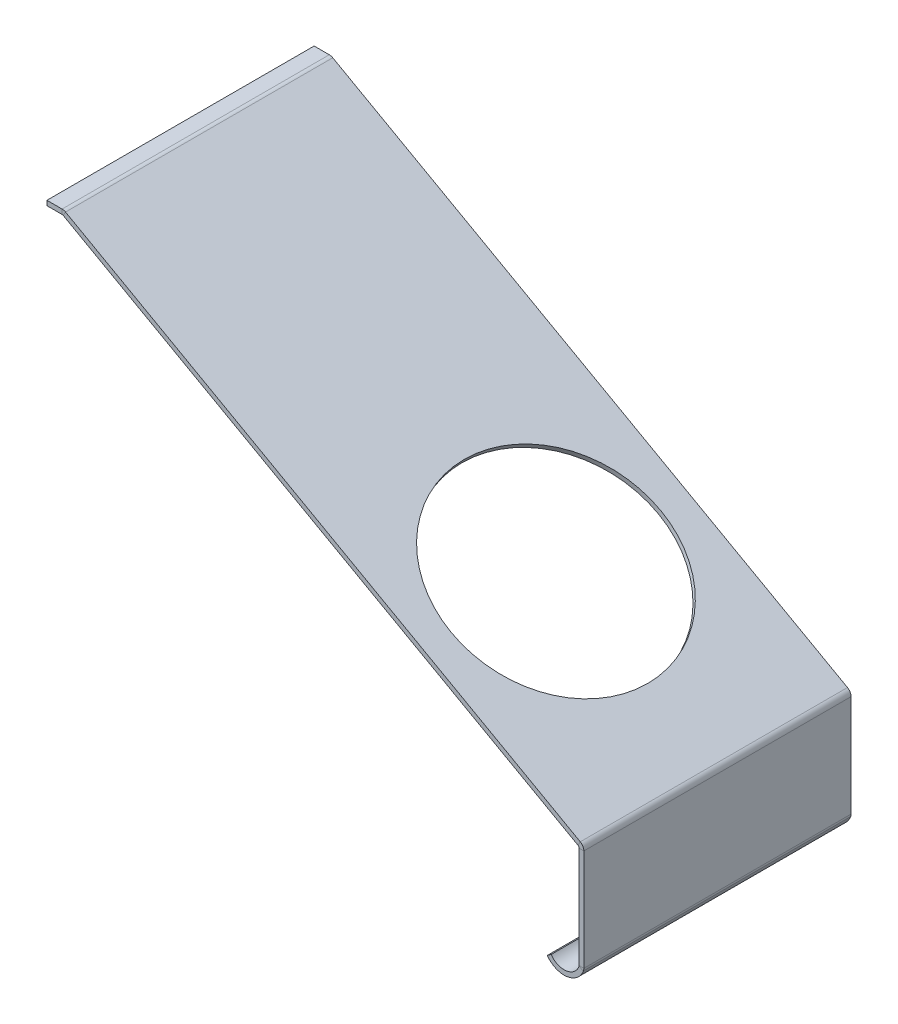
ISO-10303-21;
HEADER;
FILE_DESCRIPTION(('STEP AP214'),'2;1');
FILE_NAME('part.step','',(''),(''),'','','');
FILE_SCHEMA(('AUTOMOTIVE_DESIGN { 1 0 10303 214 1 1 1 1 }'));
ENDSEC;
DATA;
#1=APPLICATION_CONTEXT('core data for automotive mechanical design processes');
#2=APPLICATION_PROTOCOL_DEFINITION('international standard','automotive_design',2000,#1);
#3=PRODUCT_CONTEXT('',#1,'mechanical');
#4=PRODUCT('Part','Part','',(#3));
#5=PRODUCT_RELATED_PRODUCT_CATEGORY('part','',(#4));
#6=PRODUCT_DEFINITION_FORMATION('','',#4);
#7=PRODUCT_DEFINITION_CONTEXT('part definition',#1,'design');
#8=PRODUCT_DEFINITION('design','',#6,#7);
#9=PRODUCT_DEFINITION_SHAPE('','',#8);
#10=(LENGTH_UNIT() NAMED_UNIT(*) SI_UNIT(.MILLI.,.METRE.));
#11=(NAMED_UNIT(*) PLANE_ANGLE_UNIT() SI_UNIT($,.RADIAN.));
#12=(NAMED_UNIT(*) SI_UNIT($,.STERADIAN.) SOLID_ANGLE_UNIT());
#13=UNCERTAINTY_MEASURE_WITH_UNIT(LENGTH_MEASURE(1.E-05),#10,'distance_accuracy_value','');
#14=(GEOMETRIC_REPRESENTATION_CONTEXT(3) GLOBAL_UNCERTAINTY_ASSIGNED_CONTEXT((#13)) GLOBAL_UNIT_ASSIGNED_CONTEXT((#10,
#11,#12)) REPRESENTATION_CONTEXT('',''));
#15=CARTESIAN_POINT('',(0.,0.,0.));
#16=DIRECTION('',(0.,0.,1.));
#17=DIRECTION('',(1.,0.,0.));
#18=AXIS2_PLACEMENT_3D('',#15,#16,#17);
#19=CARTESIAN_POINT('',(6.13483473526349,-2.31902648571097,85.));
#20=DIRECTION('',(0.,0.,1.));
#21=DIRECTION('',(1.,0.,0.));
#22=AXIS2_PLACEMENT_3D('',#19,#20,#21);
#23=PLANE('',#22);
#24=DIRECTION('',(-0.935400382627309,0.353590333833779,0.));
#25=VECTOR('',#24,1.);
#26=CARTESIAN_POINT('',(6.13483473526349,-2.31902648571097,85.));
#27=LINE('',#26,#25);
#28=CARTESIAN_POINT('',(6.13483473526349,-2.31902648571097,85.));
#29=VERTEX_POINT('',#28);
#30=CARTESIAN_POINT('',(4.73173416132255,-1.78864098496029,85.));
#31=VERTEX_POINT('',#30);
#32=EDGE_CURVE('E11',#29,#31,#27,.T.);
#33=ORIENTED_EDGE('',*,*,#32,.F.);
#34=CARTESIAN_POINT('',(4.04271823947927,-1.52818634505836,85.));
#35=DIRECTION('',(0.,0.,-1.));
#36=DIRECTION('',(-1.,0.,0.));
#37=AXIS2_PLACEMENT_3D('',#34,#35,#36);
#38=CIRCLE('',#37,2.2366);
#39=CARTESIAN_POINT('',(6.27931823947925,-1.52818634505836,85.));
#40=VERTEX_POINT('',#39);
#41=EDGE_CURVE('E299',#40,#29,#38,.T.);
#42=ORIENTED_EDGE('',*,*,#41,.F.);
#43=DIRECTION('',(1.,0.,0.));
#44=VECTOR('',#43,1.);
#45=CARTESIAN_POINT('',(4.77931823947925,-1.52818634505836,85.));
#46=LINE('',#45,#44);
#47=CARTESIAN_POINT('',(4.77931823947925,-1.52818634505836,85.));
#48=VERTEX_POINT('',#47);
#49=EDGE_CURVE('E45',#48,#40,#46,.T.);
#50=ORIENTED_EDGE('',*,*,#49,.F.);
#51=CARTESIAN_POINT('',(4.04271823947927,-1.52818634505836,85.));
#52=DIRECTION('',(0.,0.,1.));
#53=DIRECTION('',(1.,0.,0.));
#54=AXIS2_PLACEMENT_3D('',#51,#52,#53);
#55=CIRCLE('',#54,0.7366);
#56=EDGE_CURVE('E193',#48,#31,#55,.F.);
#57=ORIENTED_EDGE('',*,*,#56,.T.);
#58=EDGE_LOOP('',(#33,#42,#50,#57));
#59=FACE_BOUND('',#58,.T.);
#60=ADVANCED_FACE('F36',(#59),#23,.T.);
#61=CARTESIAN_POINT('',(4.77931823947925,-1.52818634505836,85.));
#62=DIRECTION('',(0.,0.,1.));
#63=DIRECTION('',(1.,0.,0.));
#64=AXIS2_PLACEMENT_3D('',#61,#62,#63);
#65=PLANE('',#64);
#66=CARTESIAN_POINT('',(0.,0.,85.));
#67=DIRECTION('',(0.,0.,-1.));
#68=DIRECTION('',(-1.,0.,0.));
#69=AXIS2_PLACEMENT_3D('',#66,#67,#68);
#70=CIRCLE('',#69,6.55851210797269);
#71=CARTESIAN_POINT('',(-5.3580191885475,-3.78228918058643,85.));
#72=VERTEX_POINT('',#71);
#73=EDGE_CURVE('E303',#29,#72,#70,.T.);
#74=ORIENTED_EDGE('',*,*,#73,.F.);
#75=ORIENTED_EDGE('',*,*,#32,.T.);
#76=CARTESIAN_POINT('',(0.,0.,85.));
#77=DIRECTION('',(0.,0.,1.));
#78=DIRECTION('',(1.,0.,0.));
#79=AXIS2_PLACEMENT_3D('',#76,#77,#78);
#80=CIRCLE('',#79,5.05851210797269);
#81=CARTESIAN_POINT('',(-4.13258441759523,-2.91724026743689,85.));
#82=VERTEX_POINT('',#81);
#83=EDGE_CURVE('E117',#31,#82,#80,.F.);
#84=ORIENTED_EDGE('',*,*,#83,.T.);
#85=DIRECTION('',(0.816956513968188,0.576699275432999,0.));
#86=VECTOR('',#85,1.);
#87=CARTESIAN_POINT('',(-5.3580191885475,-3.78228918058643,85.));
#88=LINE('',#87,#86);
#89=EDGE_CURVE('E608',#72,#82,#88,.T.);
#90=ORIENTED_EDGE('',*,*,#89,.F.);
#91=EDGE_LOOP('',(#74,#75,#84,#90));
#92=FACE_BOUND('',#91,.T.);
#93=ADVANCED_FACE('F392',(#92),#65,.T.);
#94=CARTESIAN_POINT('',(6.27931823947925,-1.5281863450583,0.));
#95=DIRECTION('',(0.,0.,-1.));
#96=DIRECTION('',(-1.,0.,0.));
#97=AXIS2_PLACEMENT_3D('',#94,#95,#96);
#98=PLANE('',#97);
#99=DIRECTION('',(-1.,0.,0.));
#100=VECTOR('',#99,1.);
#101=CARTESIAN_POINT('',(6.27931823947925,-1.5281863450583,0.));
#102=LINE('',#101,#100);
#103=CARTESIAN_POINT('',(6.27931823947925,-1.5281863450583,0.));
#104=VERTEX_POINT('',#103);
#105=CARTESIAN_POINT('',(4.77931823947925,-1.5281863450583,0.));
#106=VERTEX_POINT('',#105);
#107=EDGE_CURVE('E104',#104,#106,#102,.T.);
#108=ORIENTED_EDGE('',*,*,#107,.F.);
#109=CARTESIAN_POINT('',(4.04271823947927,-1.5281863450583,0.));
#110=DIRECTION('',(0.,0.,-1.));
#111=DIRECTION('',(-1.,0.,0.));
#112=AXIS2_PLACEMENT_3D('',#109,#110,#111);
#113=CIRCLE('',#112,2.2366);
#114=CARTESIAN_POINT('',(6.13483473526349,-2.31902648571097,0.));
#115=VERTEX_POINT('',#114);
#116=EDGE_CURVE('E208',#104,#115,#113,.T.);
#117=ORIENTED_EDGE('',*,*,#116,.T.);
#118=DIRECTION('',(0.935400382627309,-0.353590333833779,0.));
#119=VECTOR('',#118,1.);
#120=CARTESIAN_POINT('',(4.7317341613225,-1.78864098496029,0.));
#121=LINE('',#120,#119);
#122=CARTESIAN_POINT('',(4.7317341613225,-1.78864098496029,0.));
#123=VERTEX_POINT('',#122);
#124=EDGE_CURVE('E111',#123,#115,#121,.T.);
#125=ORIENTED_EDGE('',*,*,#124,.F.);
#126=CARTESIAN_POINT('',(4.04271823947927,-1.5281863450583,0.));
#127=DIRECTION('',(0.,0.,1.));
#128=DIRECTION('',(1.,0.,0.));
#129=AXIS2_PLACEMENT_3D('',#126,#127,#128);
#130=CIRCLE('',#129,0.7366);
#131=EDGE_CURVE('E239',#106,#123,#130,.F.);
#132=ORIENTED_EDGE('',*,*,#131,.F.);
#133=EDGE_LOOP('',(#108,#117,#125,#132));
#134=FACE_BOUND('',#133,.T.);
#135=ADVANCED_FACE('F396',(#134),#98,.T.);
#136=CARTESIAN_POINT('',(4.7317341613225,-1.78864098496029,0.));
#137=DIRECTION('',(0.,0.,-1.));
#138=DIRECTION('',(-1.,0.,0.));
#139=AXIS2_PLACEMENT_3D('',#136,#137,#138);
#140=PLANE('',#139);
#141=DIRECTION('',(0.,-1.,0.));
#142=VECTOR('',#141,1.);
#143=CARTESIAN_POINT('',(6.27931823947925,32.1194241644101,0.));
#144=LINE('',#143,#142);
#145=CARTESIAN_POINT('',(6.27931823947925,30.8079333348794,0.));
#146=VERTEX_POINT('',#145);
#147=EDGE_CURVE('E210',#146,#104,#144,.T.);
#148=ORIENTED_EDGE('',*,*,#147,.T.);
#149=ORIENTED_EDGE('',*,*,#107,.T.);
#150=DIRECTION('',(0.,1.,0.));
#151=VECTOR('',#150,1.);
#152=CARTESIAN_POINT('',(4.77931823947925,32.1194241644101,0.));
#153=LINE('',#152,#151);
#154=CARTESIAN_POINT('',(4.77931823947925,30.8079333348794,0.));
#155=VERTEX_POINT('',#154);
#156=EDGE_CURVE('E237',#155,#106,#153,.F.);
#157=ORIENTED_EDGE('',*,*,#156,.F.);
#158=DIRECTION('',(1.,0.,0.));
#159=VECTOR('',#158,1.);
#160=CARTESIAN_POINT('',(4.77931823947925,30.8079333348794,0.));
#161=LINE('',#160,#159);
#162=EDGE_CURVE('E285',#155,#146,#161,.T.);
#163=ORIENTED_EDGE('',*,*,#162,.T.);
#164=EDGE_LOOP('',(#148,#149,#157,#163));
#165=FACE_BOUND('',#164,.T.);
#166=ADVANCED_FACE('F340',(#165),#140,.T.);
#167=CARTESIAN_POINT('',(6.27931823947925,30.8079333348794,85.));
#168=DIRECTION('',(0.,0.,1.));
#169=DIRECTION('',(1.,0.,0.));
#170=AXIS2_PLACEMENT_3D('',#167,#168,#169);
#171=PLANE('',#170);
#172=DIRECTION('',(-1.,0.,0.));
#173=VECTOR('',#172,1.);
#174=CARTESIAN_POINT('',(6.27931823947925,30.8079333348794,85.));
#175=LINE('',#174,#173);
#176=CARTESIAN_POINT('',(6.27931823947925,30.8079333348794,85.));
#177=VERTEX_POINT('',#176);
#178=CARTESIAN_POINT('',(4.77931823947925,30.8079333348794,85.));
#179=VERTEX_POINT('',#178);
#180=EDGE_CURVE('E157',#177,#179,#175,.T.);
#181=ORIENTED_EDGE('',*,*,#180,.F.);
#182=CARTESIAN_POINT('',(4.04271823947927,30.8079333348794,85.));
#183=DIRECTION('',(0.,0.,-1.));
#184=DIRECTION('',(-1.,0.,0.));
#185=AXIS2_PLACEMENT_3D('',#182,#183,#184);
#186=CIRCLE('',#185,2.2366);
#187=CARTESIAN_POINT('',(5.1347932668917,32.7597918580573,85.));
#188=VERTEX_POINT('',#187);
#189=EDGE_CURVE('E306',#188,#177,#186,.T.);
#190=ORIENTED_EDGE('',*,*,#189,.F.);
#191=DIRECTION('',(0.488274625508566,0.872690030929923,0.));
#192=VECTOR('',#191,1.);
#193=CARTESIAN_POINT('',(4.40238132862886,31.4507568116624,85.));
#194=LINE('',#193,#192);
#195=CARTESIAN_POINT('',(4.40238132862886,31.4507568116624,85.));
#196=VERTEX_POINT('',#195);
#197=EDGE_CURVE('E169',#196,#188,#194,.T.);
#198=ORIENTED_EDGE('',*,*,#197,.F.);
#199=CARTESIAN_POINT('',(4.04271823947927,30.8079333348794,85.));
#200=DIRECTION('',(0.,0.,1.));
#201=DIRECTION('',(1.,0.,0.));
#202=AXIS2_PLACEMENT_3D('',#199,#200,#201);
#203=CIRCLE('',#202,0.7366);
#204=EDGE_CURVE('E172',#196,#179,#203,.F.);
#205=ORIENTED_EDGE('',*,*,#204,.T.);
#206=EDGE_LOOP('',(#181,#190,#198,#205));
#207=FACE_BOUND('',#206,.T.);
#208=ADVANCED_FACE('F174',(#207),#171,.T.);
#209=CARTESIAN_POINT('',(4.40238132862886,31.4507568116624,85.));
#210=DIRECTION('',(0.,0.,1.));
#211=DIRECTION('',(1.,0.,0.));
#212=AXIS2_PLACEMENT_3D('',#209,#210,#211);
#213=PLANE('',#212);
#214=DIRECTION('',(0.,-1.,0.));
#215=VECTOR('',#214,1.);
#216=CARTESIAN_POINT('',(6.27931823947925,32.1194241644101,85.));
#217=LINE('',#216,#215);
#218=EDGE_CURVE('E164',#177,#40,#217,.T.);
#219=ORIENTED_EDGE('',*,*,#218,.F.);
#220=ORIENTED_EDGE('',*,*,#180,.T.);
#221=DIRECTION('',(0.,1.,0.));
#222=VECTOR('',#221,1.);
#223=CARTESIAN_POINT('',(4.77931823947925,32.1194241644101,85.));
#224=LINE('',#223,#222);
#225=EDGE_CURVE('E161',#179,#48,#224,.F.);
#226=ORIENTED_EDGE('',*,*,#225,.T.);
#227=ORIENTED_EDGE('',*,*,#49,.T.);
#228=EDGE_LOOP('',(#219,#220,#226,#227));
#229=FACE_BOUND('',#228,.T.);
#230=ADVANCED_FACE('F159',(#229),#213,.T.);
#231=CARTESIAN_POINT('',(5.1347932668917,32.7597918580573,0.));
#232=DIRECTION('',(0.,0.,-1.));
#233=DIRECTION('',(-1.,0.,0.));
#234=AXIS2_PLACEMENT_3D('',#231,#232,#233);
#235=PLANE('',#234);
#236=DIRECTION('',(-0.488274625508566,-0.872690030929923,0.));
#237=VECTOR('',#236,1.);
#238=CARTESIAN_POINT('',(5.1347932668917,32.7597918580573,0.));
#239=LINE('',#238,#237);
#240=CARTESIAN_POINT('',(5.1347932668917,32.7597918580573,0.));
#241=VERTEX_POINT('',#240);
#242=CARTESIAN_POINT('',(4.40238132862886,31.4507568116624,0.));
#243=VERTEX_POINT('',#242);
#244=EDGE_CURVE('E287',#241,#243,#239,.T.);
#245=ORIENTED_EDGE('',*,*,#244,.F.);
#246=CARTESIAN_POINT('',(4.04271823947921,30.8079333348794,0.));
#247=DIRECTION('',(0.,0.,-1.));
#248=DIRECTION('',(-1.,0.,0.));
#249=AXIS2_PLACEMENT_3D('',#246,#247,#248);
#250=CIRCLE('',#249,2.2366);
#251=EDGE_CURVE('E212',#241,#146,#250,.T.);
#252=ORIENTED_EDGE('',*,*,#251,.T.);
#253=ORIENTED_EDGE('',*,*,#162,.F.);
#254=CARTESIAN_POINT('',(4.04271823947921,30.8079333348794,0.));
#255=DIRECTION('',(0.,0.,1.));
#256=DIRECTION('',(1.,0.,0.));
#257=AXIS2_PLACEMENT_3D('',#254,#255,#256);
#258=CIRCLE('',#257,0.7366);
#259=EDGE_CURVE('E185',#243,#155,#258,.F.);
#260=ORIENTED_EDGE('',*,*,#259,.F.);
#261=EDGE_LOOP('',(#245,#252,#253,#260));
#262=FACE_BOUND('',#261,.T.);
#263=ADVANCED_FACE('F338',(#262),#235,.T.);
#264=CARTESIAN_POINT('',(4.77931823947925,30.8079333348794,0.));
#265=DIRECTION('',(0.,0.,-1.));
#266=DIRECTION('',(-1.,0.,0.));
#267=AXIS2_PLACEMENT_3D('',#264,#265,#266);
#268=PLANE('',#267);
#269=DIRECTION('',(0.872690030929894,-0.488274625508617,0.));
#270=VECTOR('',#269,1.);
#271=CARTESIAN_POINT('',(-159.108326998089,124.654674574086,0.));
#272=LINE('',#271,#270);
#273=CARTESIAN_POINT('',(-158.599410426894,124.369933097264,0.));
#274=VERTEX_POINT('',#273);
#275=EDGE_CURVE('E215',#274,#241,#272,.T.);
#276=ORIENTED_EDGE('',*,*,#275,.T.);
#277=ORIENTED_EDGE('',*,*,#244,.T.);
#278=DIRECTION('',(0.872690030929894,-0.488274625508617,0.));
#279=VECTOR('',#278,1.);
#280=CARTESIAN_POINT('',(-159.840738936351,123.345639527691,0.));
#281=LINE('',#280,#279);
#282=CARTESIAN_POINT('',(-159.331822365157,123.060898050869,0.));
#283=VERTEX_POINT('',#282);
#284=EDGE_CURVE('E233',#283,#243,#281,.T.);
#285=ORIENTED_EDGE('',*,*,#284,.F.);
#286=DIRECTION('',(0.488274625508617,0.872690030929894,0.));
#287=VECTOR('',#286,1.);
#288=CARTESIAN_POINT('',(-159.331822365157,123.060898050869,0.));
#289=LINE('',#288,#287);
#290=EDGE_CURVE('E277',#283,#274,#289,.T.);
#291=ORIENTED_EDGE('',*,*,#290,.T.);
#292=EDGE_LOOP('',(#276,#277,#285,#291));
#293=FACE_BOUND('',#292,.T.);
#294=ADVANCED_FACE('F375',(#293),#268,.T.);
#295=CARTESIAN_POINT('',(-158.599410426894,124.369933097264,85.));
#296=DIRECTION('',(0.,0.,1.));
#297=DIRECTION('',(1.,0.,0.));
#298=AXIS2_PLACEMENT_3D('',#295,#296,#297);
#299=PLANE('',#298);
#300=DIRECTION('',(-0.488274625508617,-0.872690030929894,0.));
#301=VECTOR('',#300,1.);
#302=CARTESIAN_POINT('',(-158.599410426894,124.369933097264,85.));
#303=LINE('',#302,#301);
#304=CARTESIAN_POINT('',(-158.599410426894,124.369933097264,85.));
#305=VERTEX_POINT('',#304);
#306=CARTESIAN_POINT('',(-159.331822365157,123.060898050869,85.));
#307=VERTEX_POINT('',#306);
#308=EDGE_CURVE('E283',#305,#307,#303,.T.);
#309=ORIENTED_EDGE('',*,*,#308,.F.);
#310=CARTESIAN_POINT('',(-159.691485454307,122.418074574086,85.));
#311=DIRECTION('',(0.,0.,-1.));
#312=DIRECTION('',(-1.,0.,0.));
#313=AXIS2_PLACEMENT_3D('',#310,#311,#312);
#314=CIRCLE('',#313,2.2366);
#315=CARTESIAN_POINT('',(-159.691485454307,124.654674574086,85.));
#316=VERTEX_POINT('',#315);
#317=EDGE_CURVE('E314',#316,#305,#314,.T.);
#318=ORIENTED_EDGE('',*,*,#317,.F.);
#319=DIRECTION('',(0.,1.,0.));
#320=VECTOR('',#319,1.);
#321=CARTESIAN_POINT('',(-159.691485454307,123.154674574086,85.));
#322=LINE('',#321,#320);
#323=CARTESIAN_POINT('',(-159.691485454307,123.154674574086,85.));
#324=VERTEX_POINT('',#323);
#325=EDGE_CURVE('E281',#324,#316,#322,.T.);
#326=ORIENTED_EDGE('',*,*,#325,.F.);
#327=CARTESIAN_POINT('',(-159.691485454307,122.418074574086,85.));
#328=DIRECTION('',(0.,0.,1.));
#329=DIRECTION('',(1.,0.,0.));
#330=AXIS2_PLACEMENT_3D('',#327,#328,#329);
#331=CIRCLE('',#330,0.7366);
#332=EDGE_CURVE('E326',#324,#307,#331,.F.);
#333=ORIENTED_EDGE('',*,*,#332,.T.);
#334=EDGE_LOOP('',(#309,#318,#326,#333));
#335=FACE_BOUND('',#334,.T.);
#336=ADVANCED_FACE('F353',(#335),#299,.T.);
#337=CARTESIAN_POINT('',(-159.691485454307,123.154674574086,85.));
#338=DIRECTION('',(0.,0.,1.));
#339=DIRECTION('',(1.,0.,0.));
#340=AXIS2_PLACEMENT_3D('',#337,#338,#339);
#341=PLANE('',#340);
#342=DIRECTION('',(0.872690030929894,-0.488274625508617,0.));
#343=VECTOR('',#342,1.);
#344=CARTESIAN_POINT('',(-159.108326998088,124.654674574086,85.));
#345=LINE('',#344,#343);
#346=EDGE_CURVE('E308',#305,#188,#345,.T.);
#347=ORIENTED_EDGE('',*,*,#346,.F.);
#348=ORIENTED_EDGE('',*,*,#308,.T.);
#349=DIRECTION('',(0.872690030929894,-0.488274625508617,0.));
#350=VECTOR('',#349,1.);
#351=CARTESIAN_POINT('',(-159.840738936351,123.345639527691,85.));
#352=LINE('',#351,#350);
#353=EDGE_CURVE('E178',#307,#196,#352,.T.);
#354=ORIENTED_EDGE('',*,*,#353,.T.);
#355=ORIENTED_EDGE('',*,*,#197,.T.);
#356=EDGE_LOOP('',(#347,#348,#354,#355));
#357=FACE_BOUND('',#356,.T.);
#358=ADVANCED_FACE('F332',(#357),#341,.T.);
#359=CARTESIAN_POINT('',(-159.691485454307,124.654674574086,0.));
#360=DIRECTION('',(0.,0.,-1.));
#361=DIRECTION('',(-1.,0.,0.));
#362=AXIS2_PLACEMENT_3D('',#359,#360,#361);
#363=PLANE('',#362);
#364=DIRECTION('',(0.,-1.,0.));
#365=VECTOR('',#364,1.);
#366=CARTESIAN_POINT('',(-159.691485454307,124.654674574086,0.));
#367=LINE('',#366,#365);
#368=CARTESIAN_POINT('',(-159.691485454307,124.654674574086,0.));
#369=VERTEX_POINT('',#368);
#370=CARTESIAN_POINT('',(-159.691485454307,123.154674574086,0.));
#371=VERTEX_POINT('',#370);
#372=EDGE_CURVE('E279',#369,#371,#367,.T.);
#373=ORIENTED_EDGE('',*,*,#372,.F.);
#374=CARTESIAN_POINT('',(-159.691485454307,122.418074574086,0.));
#375=DIRECTION('',(0.,0.,-1.));
#376=DIRECTION('',(-1.,0.,0.));
#377=AXIS2_PLACEMENT_3D('',#374,#375,#376);
#378=CIRCLE('',#377,2.2366);
#379=EDGE_CURVE('E218',#369,#274,#378,.T.);
#380=ORIENTED_EDGE('',*,*,#379,.T.);
#381=ORIENTED_EDGE('',*,*,#290,.F.);
#382=CARTESIAN_POINT('',(-159.691485454307,122.418074574086,0.));
#383=DIRECTION('',(0.,0.,1.));
#384=DIRECTION('',(1.,0.,0.));
#385=AXIS2_PLACEMENT_3D('',#382,#383,#384);
#386=CIRCLE('',#385,0.7366);
#387=EDGE_CURVE('E230',#371,#283,#386,.F.);
#388=ORIENTED_EDGE('',*,*,#387,.F.);
#389=EDGE_LOOP('',(#373,#380,#381,#388));
#390=FACE_BOUND('',#389,.T.);
#391=ADVANCED_FACE('F377',(#390),#363,.T.);
#392=CARTESIAN_POINT('',(-159.331822365157,123.060898050869,0.));
#393=DIRECTION('',(0.,0.,-1.));
#394=DIRECTION('',(-1.,0.,0.));
#395=AXIS2_PLACEMENT_3D('',#392,#393,#394);
#396=PLANE('',#395);
#397=DIRECTION('',(1.,0.,0.));
#398=VECTOR('',#397,1.);
#399=CARTESIAN_POINT('',(-159.108326998089,124.654674574086,0.));
#400=LINE('',#399,#398);
#401=CARTESIAN_POINT('',(-164.5169492657,124.654674574086,0.));
#402=VERTEX_POINT('',#401);
#403=EDGE_CURVE('E221',#402,#369,#400,.T.);
#404=ORIENTED_EDGE('',*,*,#403,.T.);
#405=ORIENTED_EDGE('',*,*,#372,.T.);
#406=DIRECTION('',(1.,0.,0.));
#407=VECTOR('',#406,1.);
#408=CARTESIAN_POINT('',(-159.108326998089,123.154674574086,0.));
#409=LINE('',#408,#407);
#410=CARTESIAN_POINT('',(-164.5169492657,123.154674574086,0.));
#411=VERTEX_POINT('',#410);
#412=EDGE_CURVE('E227',#411,#371,#409,.T.);
#413=ORIENTED_EDGE('',*,*,#412,.F.);
#414=DIRECTION('',(0.,1.,0.));
#415=VECTOR('',#414,1.);
#416=CARTESIAN_POINT('',(-164.5169492657,123.154674574086,0.));
#417=LINE('',#416,#415);
#418=EDGE_CURVE('E224',#411,#402,#417,.T.);
#419=ORIENTED_EDGE('',*,*,#418,.T.);
#420=EDGE_LOOP('',(#404,#405,#413,#419));
#421=FACE_BOUND('',#420,.T.);
#422=ADVANCED_FACE('F379',(#421),#396,.T.);
#423=CARTESIAN_POINT('',(0.,0.,85.));
#424=DIRECTION('',(0.,0.,-1.));
#425=DIRECTION('',(-1.,0.,0.));
#426=AXIS2_PLACEMENT_3D('',#423,#424,#425);
#427=CYLINDRICAL_SURFACE('',#426,5.05851210797269);
#428=CARTESIAN_POINT('',(0.,0.,0.));
#429=DIRECTION('',(0.,0.,1.));
#430=DIRECTION('',(1.,0.,0.));
#431=AXIS2_PLACEMENT_3D('',#428,#429,#430);
#432=CIRCLE('',#431,5.05851210797269);
#433=CARTESIAN_POINT('',(-4.13258441759523,-2.91724026743689,0.));
#434=VERTEX_POINT('',#433);
#435=EDGE_CURVE('E199',#123,#434,#432,.F.);
#436=ORIENTED_EDGE('',*,*,#435,.T.);
#437=DIRECTION('',(0.,0.,-1.));
#438=VECTOR('',#437,1.);
#439=CARTESIAN_POINT('',(-4.13258441759523,-2.91724026743689,85.));
#440=LINE('',#439,#438);
#441=EDGE_CURVE('E275',#82,#434,#440,.T.);
#442=ORIENTED_EDGE('',*,*,#441,.F.);
#443=ORIENTED_EDGE('',*,*,#83,.F.);
#444=DIRECTION('',(0.,0.,-1.));
#445=VECTOR('',#444,1.);
#446=CARTESIAN_POINT('',(4.73173416132255,-1.78864098496029,85.));
#447=LINE('',#446,#445);
#448=EDGE_CURVE('E195',#31,#123,#447,.T.);
#449=ORIENTED_EDGE('',*,*,#448,.T.);
#450=EDGE_LOOP('',(#436,#442,#443,#449));
#451=FACE_BOUND('',#450,.T.);
#452=ADVANCED_FACE('F381',(#451),#427,.F.);
#453=CARTESIAN_POINT('',(-5.3580191885475,-3.78228918058643,85.));
#454=DIRECTION('',(-0.576699275432999,0.816956513968188,0.));
#455=DIRECTION('',(-0.816956513968188,-0.576699275432999,0.));
#456=AXIS2_PLACEMENT_3D('',#453,#454,#455);
#457=PLANE('',#456);
#458=DIRECTION('',(0.816956513968188,0.576699275432999,0.));
#459=VECTOR('',#458,1.);
#460=CARTESIAN_POINT('',(-5.3580191885475,-3.78228918058637,0.));
#461=LINE('',#460,#459);
#462=CARTESIAN_POINT('',(-5.3580191885475,-3.78228918058637,0.));
#463=VERTEX_POINT('',#462);
#464=EDGE_CURVE('E202',#463,#434,#461,.T.);
#465=ORIENTED_EDGE('',*,*,#464,.F.);
#466=DIRECTION('',(0.,0.,-1.));
#467=VECTOR('',#466,1.);
#468=CARTESIAN_POINT('',(-5.3580191885475,-3.78228918058643,85.));
#469=LINE('',#468,#467);
#470=EDGE_CURVE('E273',#72,#463,#469,.T.);
#471=ORIENTED_EDGE('',*,*,#470,.F.);
#472=ORIENTED_EDGE('',*,*,#89,.T.);
#473=ORIENTED_EDGE('',*,*,#441,.T.);
#474=EDGE_LOOP('',(#465,#471,#472,#473));
#475=FACE_BOUND('',#474,.T.);
#476=ADVANCED_FACE('F387',(#475),#457,.T.);
#477=CARTESIAN_POINT('',(0.,0.,85.));
#478=DIRECTION('',(0.,0.,-1.));
#479=DIRECTION('',(-1.,0.,0.));
#480=AXIS2_PLACEMENT_3D('',#477,#478,#479);
#481=CYLINDRICAL_SURFACE('',#480,6.55851210797269);
#482=CARTESIAN_POINT('',(0.,0.,0.));
#483=DIRECTION('',(0.,0.,-1.));
#484=DIRECTION('',(-1.,0.,0.));
#485=AXIS2_PLACEMENT_3D('',#482,#483,#484);
#486=CIRCLE('',#485,6.55851210797269);
#487=EDGE_CURVE('E205',#115,#463,#486,.T.);
#488=ORIENTED_EDGE('',*,*,#487,.F.);
#489=DIRECTION('',(0.,0.,-1.));
#490=VECTOR('',#489,1.);
#491=CARTESIAN_POINT('',(6.13483473526349,-2.31902648571097,85.));
#492=LINE('',#491,#490);
#493=EDGE_CURVE('E270',#29,#115,#492,.T.);
#494=ORIENTED_EDGE('',*,*,#493,.F.);
#495=ORIENTED_EDGE('',*,*,#73,.T.);
#496=ORIENTED_EDGE('',*,*,#470,.T.);
#497=EDGE_LOOP('',(#488,#494,#495,#496));
#498=FACE_BOUND('',#497,.T.);
#499=ADVANCED_FACE('F449',(#498),#481,.T.);
#500=CARTESIAN_POINT('',(4.04271823947927,-1.52818634505836,85.));
#501=DIRECTION('',(0.,0.,-1.));
#502=DIRECTION('',(-1.,0.,0.));
#503=AXIS2_PLACEMENT_3D('',#500,#501,#502);
#504=CYLINDRICAL_SURFACE('',#503,2.2366);
#505=ORIENTED_EDGE('',*,*,#116,.F.);
#506=DIRECTION('',(0.,0.,-1.));
#507=VECTOR('',#506,1.);
#508=CARTESIAN_POINT('',(6.27931823947925,-1.52818634505836,85.));
#509=LINE('',#508,#507);
#510=EDGE_CURVE('E267',#40,#104,#509,.T.);
#511=ORIENTED_EDGE('',*,*,#510,.F.);
#512=ORIENTED_EDGE('',*,*,#41,.T.);
#513=ORIENTED_EDGE('',*,*,#493,.T.);
#514=EDGE_LOOP('',(#505,#511,#512,#513));
#515=FACE_BOUND('',#514,.T.);
#516=ADVANCED_FACE('F298',(#515),#504,.T.);
#517=CARTESIAN_POINT('',(6.27931823947925,32.1194241644101,85.));
#518=DIRECTION('',(1.,0.,0.));
#519=DIRECTION('',(0.,0.,-1.));
#520=AXIS2_PLACEMENT_3D('',#517,#518,#519);
#521=PLANE('',#520);
#522=ORIENTED_EDGE('',*,*,#147,.F.);
#523=DIRECTION('',(0.,0.,-1.));
#524=VECTOR('',#523,1.);
#525=CARTESIAN_POINT('',(6.27931823947925,30.8079333348794,85.));
#526=LINE('',#525,#524);
#527=EDGE_CURVE('E264',#177,#146,#526,.T.);
#528=ORIENTED_EDGE('',*,*,#527,.F.);
#529=ORIENTED_EDGE('',*,*,#218,.T.);
#530=ORIENTED_EDGE('',*,*,#510,.T.);
#531=EDGE_LOOP('',(#522,#528,#529,#530));
#532=FACE_BOUND('',#531,.T.);
#533=ADVANCED_FACE('F305',(#532),#521,.T.);
#534=CARTESIAN_POINT('',(4.04271823947927,30.8079333348794,85.));
#535=DIRECTION('',(0.,0.,-1.));
#536=DIRECTION('',(-1.,0.,0.));
#537=AXIS2_PLACEMENT_3D('',#534,#535,#536);
#538=CYLINDRICAL_SURFACE('',#537,2.2366);
#539=ORIENTED_EDGE('',*,*,#251,.F.);
#540=DIRECTION('',(0.,0.,-1.));
#541=VECTOR('',#540,1.);
#542=CARTESIAN_POINT('',(5.1347932668917,32.7597918580573,85.));
#543=LINE('',#542,#541);
#544=EDGE_CURVE('E261',#188,#241,#543,.T.);
#545=ORIENTED_EDGE('',*,*,#544,.F.);
#546=ORIENTED_EDGE('',*,*,#189,.T.);
#547=ORIENTED_EDGE('',*,*,#527,.T.);
#548=EDGE_LOOP('',(#539,#545,#546,#547));
#549=FACE_BOUND('',#548,.T.);
#550=ADVANCED_FACE('F342',(#549),#538,.T.);
#551=CARTESIAN_POINT('',(-159.108326998088,124.654674574086,85.));
#552=DIRECTION('',(0.488274625508618,0.872690030929894,0.));
#553=DIRECTION('',(-0.872690030929894,0.488274625508618,0.));
#554=AXIS2_PLACEMENT_3D('',#551,#552,#553);
#555=PLANE('',#554);
#556=CARTESIAN_POINT('',(-45.1032586438715,60.8682440158899,42.5));
#557=DIRECTION('',(0.488274625508618,0.872690030929894,0.));
#558=DIRECTION('',(-0.872690030929894,0.488274625508618,0.));
#559=AXIS2_PLACEMENT_3D('',#556,#557,#558);
#560=CIRCLE('',#559,33.4070171158368);
#561=CARTESIAN_POINT('',(-74.2572294439667,77.1800427874851,42.5));
#562=VERTEX_POINT('',#561);
#563=EDGE_CURVE('E602',#562,#562,#560,.T.);
#564=ORIENTED_EDGE('',*,*,#563,.F.);
#565=EDGE_LOOP('',(#564));
#566=FACE_BOUND('',#565,.T.);
#567=ORIENTED_EDGE('',*,*,#275,.F.);
#568=DIRECTION('',(0.,0.,-1.));
#569=VECTOR('',#568,1.);
#570=CARTESIAN_POINT('',(-158.599410426894,124.369933097264,85.));
#571=LINE('',#570,#569);
#572=EDGE_CURVE('E258',#305,#274,#571,.T.);
#573=ORIENTED_EDGE('',*,*,#572,.F.);
#574=ORIENTED_EDGE('',*,*,#346,.T.);
#575=ORIENTED_EDGE('',*,*,#544,.T.);
#576=EDGE_LOOP('',(#567,#573,#574,#575));
#577=FACE_BOUND('',#576,.T.);
#578=ADVANCED_FACE('F346',(#566,#577),#555,.T.);
#579=CARTESIAN_POINT('',(-159.691485454307,122.418074574086,85.));
#580=DIRECTION('',(0.,0.,-1.));
#581=DIRECTION('',(-1.,0.,0.));
#582=AXIS2_PLACEMENT_3D('',#579,#580,#581);
#583=CYLINDRICAL_SURFACE('',#582,2.2366);
#584=ORIENTED_EDGE('',*,*,#379,.F.);
#585=DIRECTION('',(0.,0.,-1.));
#586=VECTOR('',#585,1.);
#587=CARTESIAN_POINT('',(-159.691485454307,124.654674574086,85.));
#588=LINE('',#587,#586);
#589=EDGE_CURVE('E255',#316,#369,#588,.T.);
#590=ORIENTED_EDGE('',*,*,#589,.F.);
#591=ORIENTED_EDGE('',*,*,#317,.T.);
#592=ORIENTED_EDGE('',*,*,#572,.T.);
#593=EDGE_LOOP('',(#584,#590,#591,#592));
#594=FACE_BOUND('',#593,.T.);
#595=ADVANCED_FACE('F351',(#594),#583,.T.);
#596=CARTESIAN_POINT('',(-159.108326998088,124.654674574086,85.));
#597=DIRECTION('',(0.,1.,0.));
#598=DIRECTION('',(0.,0.,1.));
#599=AXIS2_PLACEMENT_3D('',#596,#597,#598);
#600=PLANE('',#599);
#601=ORIENTED_EDGE('',*,*,#403,.F.);
#602=DIRECTION('',(0.,0.,-1.));
#603=VECTOR('',#602,1.);
#604=CARTESIAN_POINT('',(-164.5169492657,124.654674574086,85.));
#605=LINE('',#604,#603);
#606=CARTESIAN_POINT('',(-164.5169492657,124.654674574086,85.));
#607=VERTEX_POINT('',#606);
#608=EDGE_CURVE('E253',#607,#402,#605,.T.);
#609=ORIENTED_EDGE('',*,*,#608,.F.);
#610=DIRECTION('',(1.,0.,0.));
#611=VECTOR('',#610,1.);
#612=CARTESIAN_POINT('',(-159.108326998088,124.654674574086,85.));
#613=LINE('',#612,#611);
#614=EDGE_CURVE('E317',#607,#316,#613,.T.);
#615=ORIENTED_EDGE('',*,*,#614,.T.);
#616=ORIENTED_EDGE('',*,*,#589,.T.);
#617=EDGE_LOOP('',(#601,#609,#615,#616));
#618=FACE_BOUND('',#617,.T.);
#619=ADVANCED_FACE('F357',(#618),#600,.T.);
#620=CARTESIAN_POINT('',(-164.5169492657,123.154674574086,85.));
#621=DIRECTION('',(-1.,0.,0.));
#622=DIRECTION('',(0.,0.,1.));
#623=AXIS2_PLACEMENT_3D('',#620,#621,#622);
#624=PLANE('',#623);
#625=ORIENTED_EDGE('',*,*,#418,.F.);
#626=DIRECTION('',(0.,0.,-1.));
#627=VECTOR('',#626,1.);
#628=CARTESIAN_POINT('',(-164.5169492657,123.154674574086,85.));
#629=LINE('',#628,#627);
#630=CARTESIAN_POINT('',(-164.5169492657,123.154674574086,85.));
#631=VERTEX_POINT('',#630);
#632=EDGE_CURVE('E251',#631,#411,#629,.T.);
#633=ORIENTED_EDGE('',*,*,#632,.F.);
#634=DIRECTION('',(0.,1.,0.));
#635=VECTOR('',#634,1.);
#636=CARTESIAN_POINT('',(-164.5169492657,123.154674574086,85.));
#637=LINE('',#636,#635);
#638=EDGE_CURVE('E320',#631,#607,#637,.T.);
#639=ORIENTED_EDGE('',*,*,#638,.T.);
#640=ORIENTED_EDGE('',*,*,#608,.T.);
#641=EDGE_LOOP('',(#625,#633,#639,#640));
#642=FACE_BOUND('',#641,.T.);
#643=ADVANCED_FACE('F363',(#642),#624,.T.);
#644=CARTESIAN_POINT('',(-159.108326998088,123.154674574086,85.));
#645=DIRECTION('',(0.,1.,0.));
#646=DIRECTION('',(0.,0.,1.));
#647=AXIS2_PLACEMENT_3D('',#644,#645,#646);
#648=PLANE('',#647);
#649=ORIENTED_EDGE('',*,*,#412,.T.);
#650=DIRECTION('',(0.,0.,-1.));
#651=VECTOR('',#650,1.);
#652=CARTESIAN_POINT('',(-159.691485454307,123.154674574086,85.));
#653=LINE('',#652,#651);
#654=EDGE_CURVE('E248',#324,#371,#653,.T.);
#655=ORIENTED_EDGE('',*,*,#654,.F.);
#656=DIRECTION('',(1.,0.,0.));
#657=VECTOR('',#656,1.);
#658=CARTESIAN_POINT('',(-159.108326998088,123.154674574086,85.));
#659=LINE('',#658,#657);
#660=EDGE_CURVE('E323',#631,#324,#659,.T.);
#661=ORIENTED_EDGE('',*,*,#660,.F.);
#662=ORIENTED_EDGE('',*,*,#632,.T.);
#663=EDGE_LOOP('',(#649,#655,#661,#662));
#664=FACE_BOUND('',#663,.T.);
#665=ADVANCED_FACE('F368',(#664),#648,.F.);
#666=CARTESIAN_POINT('',(-159.691485454307,122.418074574086,85.));
#667=DIRECTION('',(0.,0.,-1.));
#668=DIRECTION('',(-1.,0.,0.));
#669=AXIS2_PLACEMENT_3D('',#666,#667,#668);
#670=CYLINDRICAL_SURFACE('',#669,0.7366);
#671=ORIENTED_EDGE('',*,*,#387,.T.);
#672=DIRECTION('',(0.,0.,-1.));
#673=VECTOR('',#672,1.);
#674=CARTESIAN_POINT('',(-159.331822365157,123.060898050869,85.));
#675=LINE('',#674,#673);
#676=EDGE_CURVE('E245',#307,#283,#675,.T.);
#677=ORIENTED_EDGE('',*,*,#676,.F.);
#678=ORIENTED_EDGE('',*,*,#332,.F.);
#679=ORIENTED_EDGE('',*,*,#654,.T.);
#680=EDGE_LOOP('',(#671,#677,#678,#679));
#681=FACE_BOUND('',#680,.T.);
#682=ADVANCED_FACE('F373',(#681),#670,.F.);
#683=CARTESIAN_POINT('',(-159.840738936351,123.345639527691,85.));
#684=DIRECTION('',(0.488274625508617,0.872690030929894,0.));
#685=DIRECTION('',(-0.872690030929894,0.488274625508617,0.));
#686=AXIS2_PLACEMENT_3D('',#683,#684,#685);
#687=PLANE('',#686);
#688=CARTESIAN_POINT('',(-45.8356705821344,59.559208969495,42.5));
#689=DIRECTION('',(0.488274625508617,0.872690030929894,0.));
#690=DIRECTION('',(-0.872690030929894,0.488274625508617,0.));
#691=AXIS2_PLACEMENT_3D('',#688,#689,#690);
#692=CIRCLE('',#691,33.4070171158368);
#693=CARTESIAN_POINT('',(-74.9896413822296,75.8710077410902,42.5));
#694=VERTEX_POINT('',#693);
#695=EDGE_CURVE('E39',#694,#694,#692,.T.);
#696=ORIENTED_EDGE('',*,*,#695,.T.);
#697=EDGE_LOOP('',(#696));
#698=FACE_BOUND('',#697,.T.);
#699=ORIENTED_EDGE('',*,*,#284,.T.);
#700=DIRECTION('',(0.,0.,-1.));
#701=VECTOR('',#700,1.);
#702=CARTESIAN_POINT('',(4.40238132862886,31.4507568116624,85.));
#703=LINE('',#702,#701);
#704=EDGE_CURVE('E187',#196,#243,#703,.T.);
#705=ORIENTED_EDGE('',*,*,#704,.F.);
#706=ORIENTED_EDGE('',*,*,#353,.F.);
#707=ORIENTED_EDGE('',*,*,#676,.T.);
#708=EDGE_LOOP('',(#699,#705,#706,#707));
#709=FACE_BOUND('',#708,.T.);
#710=ADVANCED_FACE('F335',(#698,#709),#687,.F.);
#711=CARTESIAN_POINT('',(4.04271823947927,30.8079333348794,85.));
#712=DIRECTION('',(0.,0.,-1.));
#713=DIRECTION('',(-1.,0.,0.));
#714=AXIS2_PLACEMENT_3D('',#711,#712,#713);
#715=CYLINDRICAL_SURFACE('',#714,0.7366);
#716=ORIENTED_EDGE('',*,*,#259,.T.);
#717=DIRECTION('',(0.,0.,-1.));
#718=VECTOR('',#717,1.);
#719=CARTESIAN_POINT('',(4.77931823947925,30.8079333348794,85.));
#720=LINE('',#719,#718);
#721=EDGE_CURVE('E182',#179,#155,#720,.T.);
#722=ORIENTED_EDGE('',*,*,#721,.F.);
#723=ORIENTED_EDGE('',*,*,#204,.F.);
#724=ORIENTED_EDGE('',*,*,#704,.T.);
#725=EDGE_LOOP('',(#716,#722,#723,#724));
#726=FACE_BOUND('',#725,.T.);
#727=ADVANCED_FACE('F183',(#726),#715,.F.);
#728=CARTESIAN_POINT('',(4.77931823947925,32.1194241644101,85.));
#729=DIRECTION('',(1.,0.,0.));
#730=DIRECTION('',(0.,0.,-1.));
#731=AXIS2_PLACEMENT_3D('',#728,#729,#730);
#732=PLANE('',#731);
#733=ORIENTED_EDGE('',*,*,#156,.T.);
#734=DIRECTION('',(0.,0.,-1.));
#735=VECTOR('',#734,1.);
#736=CARTESIAN_POINT('',(4.77931823947925,-1.52818634505836,85.));
#737=LINE('',#736,#735);
#738=EDGE_CURVE('E188',#48,#106,#737,.T.);
#739=ORIENTED_EDGE('',*,*,#738,.F.);
#740=ORIENTED_EDGE('',*,*,#225,.F.);
#741=ORIENTED_EDGE('',*,*,#721,.T.);
#742=EDGE_LOOP('',(#733,#739,#740,#741));
#743=FACE_BOUND('',#742,.T.);
#744=ADVANCED_FACE('F190',(#743),#732,.F.);
#745=CARTESIAN_POINT('',(4.04271823947927,-1.52818634505836,85.));
#746=DIRECTION('',(0.,0.,-1.));
#747=DIRECTION('',(-1.,0.,0.));
#748=AXIS2_PLACEMENT_3D('',#745,#746,#747);
#749=CYLINDRICAL_SURFACE('',#748,0.7366);
#750=ORIENTED_EDGE('',*,*,#131,.T.);
#751=ORIENTED_EDGE('',*,*,#448,.F.);
#752=ORIENTED_EDGE('',*,*,#56,.F.);
#753=ORIENTED_EDGE('',*,*,#738,.T.);
#754=EDGE_LOOP('',(#750,#751,#752,#753));
#755=FACE_BOUND('',#754,.T.);
#756=ADVANCED_FACE('F562',(#755),#749,.F.);
#757=CARTESIAN_POINT('',(0.,0.,85.));
#758=DIRECTION('',(0.,0.,1.));
#759=DIRECTION('',(1.,0.,0.));
#760=AXIS2_PLACEMENT_3D('',#757,#758,#759);
#761=PLANE('',#760);
#762=ORIENTED_EDGE('',*,*,#660,.T.);
#763=ORIENTED_EDGE('',*,*,#325,.T.);
#764=ORIENTED_EDGE('',*,*,#614,.F.);
#765=ORIENTED_EDGE('',*,*,#638,.F.);
#766=EDGE_LOOP('',(#762,#763,#764,#765));
#767=FACE_BOUND('',#766,.T.);
#768=ADVANCED_FACE('F360',(#767),#761,.T.);
#769=CARTESIAN_POINT('',(0.,0.,0.));
#770=DIRECTION('',(0.,0.,1.));
#771=DIRECTION('',(1.,0.,0.));
#772=AXIS2_PLACEMENT_3D('',#769,#770,#771);
#773=PLANE('',#772);
#774=ORIENTED_EDGE('',*,*,#435,.F.);
#775=ORIENTED_EDGE('',*,*,#124,.T.);
#776=ORIENTED_EDGE('',*,*,#487,.T.);
#777=ORIENTED_EDGE('',*,*,#464,.T.);
#778=EDGE_LOOP('',(#774,#775,#776,#777));
#779=FACE_BOUND('',#778,.T.);
#780=ADVANCED_FACE('F579',(#779),#773,.F.);
#781=CARTESIAN_POINT('',(-59.7514974091301,34.687543087993,42.5));
#782=DIRECTION('',(0.488274625508618,0.872690030929894,0.));
#783=DIRECTION('',(-0.872690030929894,0.488274625508618,0.));
#784=AXIS2_PLACEMENT_3D('',#781,#782,#783);
#785=CYLINDRICAL_SURFACE('',#784,33.4070171158368);
#786=ORIENTED_EDGE('',*,*,#563,.T.);
#787=EDGE_LOOP('',(#786));
#788=FACE_BOUND('',#787,.T.);
#789=ORIENTED_EDGE('',*,*,#695,.F.);
#790=EDGE_LOOP('',(#789));
#791=FACE_BOUND('',#790,.T.);
#792=ADVANCED_FACE('F587',(#788,#791),#785,.F.);
#793=CLOSED_SHELL('',(#60,#93,#135,#166,#208,#230,#263,#294,#336,#358,#391,#422,#452,#476,#499,
#516,#533,#550,#578,#595,#619,#643,#665,#682,#710,#727,#744,#756,#768,#780,#792));
#794=MANIFOLD_SOLID_BREP('B2',#793);
#795=ADVANCED_BREP_SHAPE_REPRESENTATION('',(#18,#794),#14);
#796=SHAPE_DEFINITION_REPRESENTATION(#9,#795);
ENDSEC;
END-ISO-10303-21;
